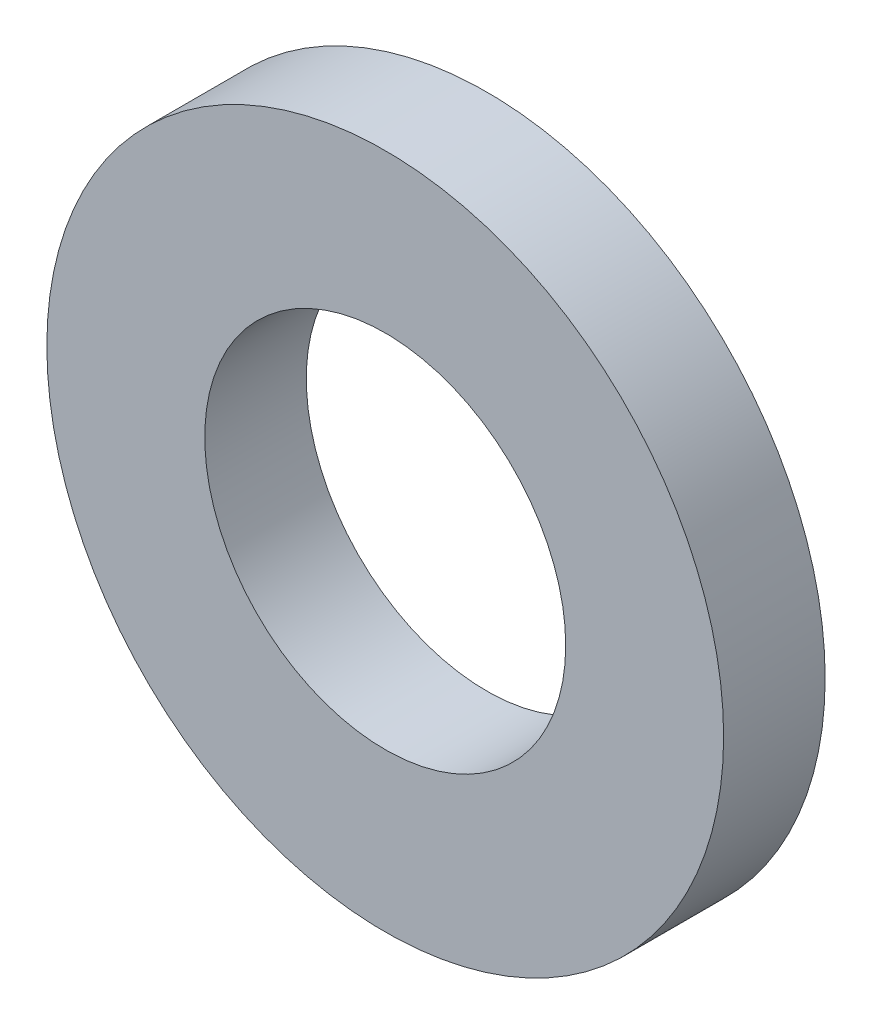
ISO-10303-21;
HEADER;
FILE_DESCRIPTION(('STEP AP214'),'2;1');
FILE_NAME('part.step','',(''),(''),'','','');
FILE_SCHEMA(('AUTOMOTIVE_DESIGN { 1 0 10303 214 1 1 1 1 }'));
ENDSEC;
DATA;
#1=APPLICATION_CONTEXT('core data for automotive mechanical design processes');
#2=APPLICATION_PROTOCOL_DEFINITION('international standard','automotive_design',2000,#1);
#3=PRODUCT_CONTEXT('',#1,'mechanical');
#4=PRODUCT('Part','Part','',(#3));
#5=PRODUCT_RELATED_PRODUCT_CATEGORY('part','',(#4));
#6=PRODUCT_DEFINITION_FORMATION('','',#4);
#7=PRODUCT_DEFINITION_CONTEXT('part definition',#1,'design');
#8=PRODUCT_DEFINITION('design','',#6,#7);
#9=PRODUCT_DEFINITION_SHAPE('','',#8);
#10=(LENGTH_UNIT() NAMED_UNIT(*) SI_UNIT(.MILLI.,.METRE.));
#11=(NAMED_UNIT(*) PLANE_ANGLE_UNIT() SI_UNIT($,.RADIAN.));
#12=(NAMED_UNIT(*) SI_UNIT($,.STERADIAN.) SOLID_ANGLE_UNIT());
#13=UNCERTAINTY_MEASURE_WITH_UNIT(LENGTH_MEASURE(1.E-05),#10,'distance_accuracy_value','');
#14=(GEOMETRIC_REPRESENTATION_CONTEXT(3) GLOBAL_UNCERTAINTY_ASSIGNED_CONTEXT((#13)) GLOBAL_UNIT_ASSIGNED_CONTEXT((#10,
#11,#12)) REPRESENTATION_CONTEXT('',''));
#15=CARTESIAN_POINT('',(0.,0.,0.));
#16=DIRECTION('',(0.,0.,1.));
#17=DIRECTION('',(1.,0.,0.));
#18=AXIS2_PLACEMENT_3D('',#15,#16,#17);
#19=CARTESIAN_POINT('',(0.,0.,1.8));
#20=DIRECTION('',(0.,0.,1.));
#21=DIRECTION('',(1.,0.,0.));
#22=AXIS2_PLACEMENT_3D('',#19,#20,#21);
#23=PLANE('',#22);
#24=CARTESIAN_POINT('',(0.,0.,1.8));
#25=DIRECTION('',(0.,0.,1.));
#26=DIRECTION('',(1.,0.,0.));
#27=AXIS2_PLACEMENT_3D('',#24,#25,#26);
#28=CIRCLE('',#27,6.);
#29=CARTESIAN_POINT('',(6.,0.,1.8));
#30=VERTEX_POINT('',#29);
#31=EDGE_CURVE('E10',#30,#30,#28,.T.);
#32=ORIENTED_EDGE('',*,*,#31,.T.);
#33=EDGE_LOOP('',(#32));
#34=FACE_BOUND('',#33,.T.);
#35=CARTESIAN_POINT('',(0.,0.,1.8));
#36=DIRECTION('',(0.,0.,1.));
#37=DIRECTION('',(1.,0.,0.));
#38=AXIS2_PLACEMENT_3D('',#35,#36,#37);
#39=CIRCLE('',#38,3.2);
#40=CARTESIAN_POINT('',(3.2,0.,1.8));
#41=VERTEX_POINT('',#40);
#42=EDGE_CURVE('E45',#41,#41,#39,.T.);
#43=ORIENTED_EDGE('',*,*,#42,.F.);
#44=EDGE_LOOP('',(#43));
#45=FACE_BOUND('',#44,.T.);
#46=ADVANCED_FACE('F34',(#34,#45),#23,.T.);
#47=CARTESIAN_POINT('',(0.,0.,0.));
#48=DIRECTION('',(0.,0.,1.));
#49=DIRECTION('',(1.,0.,0.));
#50=AXIS2_PLACEMENT_3D('',#47,#48,#49);
#51=PLANE('',#50);
#52=CARTESIAN_POINT('',(0.,0.,0.));
#53=DIRECTION('',(0.,0.,1.));
#54=DIRECTION('',(1.,0.,0.));
#55=AXIS2_PLACEMENT_3D('',#52,#53,#54);
#56=CIRCLE('',#55,6.);
#57=CARTESIAN_POINT('',(6.,0.,0.));
#58=VERTEX_POINT('',#57);
#59=EDGE_CURVE('E38',#58,#58,#56,.T.);
#60=ORIENTED_EDGE('',*,*,#59,.F.);
#61=EDGE_LOOP('',(#60));
#62=FACE_BOUND('',#61,.T.);
#63=CARTESIAN_POINT('',(0.,0.,0.));
#64=DIRECTION('',(0.,0.,1.));
#65=DIRECTION('',(1.,0.,0.));
#66=AXIS2_PLACEMENT_3D('',#63,#64,#65);
#67=CIRCLE('',#66,3.2);
#68=CARTESIAN_POINT('',(3.2,0.,0.));
#69=VERTEX_POINT('',#68);
#70=EDGE_CURVE('E47',#69,#69,#67,.T.);
#71=ORIENTED_EDGE('',*,*,#70,.T.);
#72=EDGE_LOOP('',(#71));
#73=FACE_BOUND('',#72,.T.);
#74=ADVANCED_FACE('F57',(#62,#73),#51,.F.);
#75=CARTESIAN_POINT('',(0.,0.,1.8));
#76=DIRECTION('',(0.,0.,-1.));
#77=DIRECTION('',(-1.,0.,0.));
#78=AXIS2_PLACEMENT_3D('',#75,#76,#77);
#79=CYLINDRICAL_SURFACE('',#78,6.);
#80=ORIENTED_EDGE('',*,*,#31,.F.);
#81=EDGE_LOOP('',(#80));
#82=FACE_BOUND('',#81,.T.);
#83=ORIENTED_EDGE('',*,*,#59,.T.);
#84=EDGE_LOOP('',(#83));
#85=FACE_BOUND('',#84,.T.);
#86=ADVANCED_FACE('F36',(#82,#85),#79,.T.);
#87=CARTESIAN_POINT('',(0.,0.,1.8));
#88=DIRECTION('',(0.,0.,-1.));
#89=DIRECTION('',(-1.,0.,0.));
#90=AXIS2_PLACEMENT_3D('',#87,#88,#89);
#91=CYLINDRICAL_SURFACE('',#90,3.2);
#92=ORIENTED_EDGE('',*,*,#42,.T.);
#93=EDGE_LOOP('',(#92));
#94=FACE_BOUND('',#93,.T.);
#95=ORIENTED_EDGE('',*,*,#70,.F.);
#96=EDGE_LOOP('',(#95));
#97=FACE_BOUND('',#96,.T.);
#98=ADVANCED_FACE('F53',(#94,#97),#91,.F.);
#99=CLOSED_SHELL('',(#46,#74,#86,#98));
#100=MANIFOLD_SOLID_BREP('B2',#99);
#101=ADVANCED_BREP_SHAPE_REPRESENTATION('',(#18,#100),#14);
#102=SHAPE_DEFINITION_REPRESENTATION(#9,#101);
ENDSEC;
END-ISO-10303-21;
